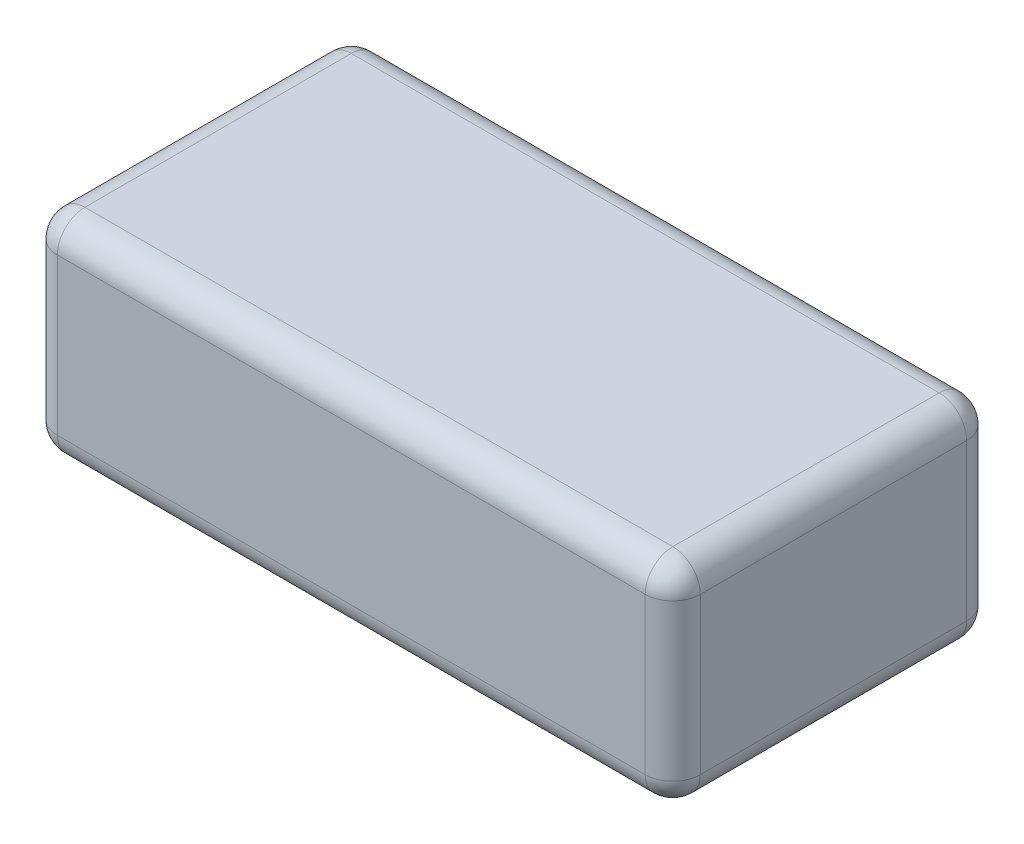
ISO-10303-21;
HEADER;
FILE_DESCRIPTION(('STEP AP214'),'2;1');
FILE_NAME('part.step','',(''),(''),'','','');
FILE_SCHEMA(('AUTOMOTIVE_DESIGN { 1 0 10303 214 1 1 1 1 }'));
ENDSEC;
DATA;
#1=APPLICATION_CONTEXT('core data for automotive mechanical design processes');
#2=APPLICATION_PROTOCOL_DEFINITION('international standard','automotive_design',2000,#1);
#3=PRODUCT_CONTEXT('',#1,'mechanical');
#4=PRODUCT('Part','Part','',(#3));
#5=PRODUCT_RELATED_PRODUCT_CATEGORY('part','',(#4));
#6=PRODUCT_DEFINITION_FORMATION('','',#4);
#7=PRODUCT_DEFINITION_CONTEXT('part definition',#1,'design');
#8=PRODUCT_DEFINITION('design','',#6,#7);
#9=PRODUCT_DEFINITION_SHAPE('','',#8);
#10=(LENGTH_UNIT() NAMED_UNIT(*) SI_UNIT(.MILLI.,.METRE.));
#11=(NAMED_UNIT(*) PLANE_ANGLE_UNIT() SI_UNIT($,.RADIAN.));
#12=(NAMED_UNIT(*) SI_UNIT($,.STERADIAN.) SOLID_ANGLE_UNIT());
#13=UNCERTAINTY_MEASURE_WITH_UNIT(LENGTH_MEASURE(1.E-05),#10,'distance_accuracy_value','');
#14=(GEOMETRIC_REPRESENTATION_CONTEXT(3) GLOBAL_UNCERTAINTY_ASSIGNED_CONTEXT((#13)) GLOBAL_UNIT_ASSIGNED_CONTEXT((#10,
#11,#12)) REPRESENTATION_CONTEXT('',''));
#15=CARTESIAN_POINT('',(0.,0.,0.));
#16=DIRECTION('',(0.,0.,1.));
#17=DIRECTION('',(1.,0.,0.));
#18=AXIS2_PLACEMENT_3D('',#15,#16,#17);
#19=CARTESIAN_POINT('',(-35.,-11.5,17.5));
#20=DIRECTION('',(0.,1.,0.));
#21=DIRECTION('',(0.,0.,1.));
#22=AXIS2_PLACEMENT_3D('',#19,#20,#21);
#23=PLANE('',#22);
#24=DIRECTION('',(0.,0.,-1.));
#25=VECTOR('',#24,1.);
#26=CARTESIAN_POINT('',(32.,-11.5,17.5));
#27=LINE('',#26,#25);
#28=CARTESIAN_POINT('',(32.,-11.5,-14.5));
#29=VERTEX_POINT('',#28);
#30=CARTESIAN_POINT('',(32.,-11.5,14.5));
#31=VERTEX_POINT('',#30);
#32=EDGE_CURVE('E131',#29,#31,#27,.F.);
#33=ORIENTED_EDGE('',*,*,#32,.T.);
#34=DIRECTION('',(1.,0.,0.));
#35=VECTOR('',#34,1.);
#36=CARTESIAN_POINT('',(-35.,-11.5,14.5));
#37=LINE('',#36,#35);
#38=CARTESIAN_POINT('',(-32.,-11.5,14.5));
#39=VERTEX_POINT('',#38);
#40=EDGE_CURVE('E168',#31,#39,#37,.F.);
#41=ORIENTED_EDGE('',*,*,#40,.T.);
#42=DIRECTION('',(0.,0.,-1.));
#43=VECTOR('',#42,1.);
#44=CARTESIAN_POINT('',(-32.,-11.5,17.5));
#45=LINE('',#44,#43);
#46=CARTESIAN_POINT('',(-32.,-11.5,-14.5));
#47=VERTEX_POINT('',#46);
#48=EDGE_CURVE('E165',#39,#47,#45,.T.);
#49=ORIENTED_EDGE('',*,*,#48,.T.);
#50=DIRECTION('',(1.,0.,0.));
#51=VECTOR('',#50,1.);
#52=CARTESIAN_POINT('',(35.,-11.5,-14.5));
#53=LINE('',#52,#51);
#54=EDGE_CURVE('E160',#47,#29,#53,.T.);
#55=ORIENTED_EDGE('',*,*,#54,.T.);
#56=EDGE_LOOP('',(#33,#41,#49,#55));
#57=FACE_BOUND('',#56,.T.);
#58=ADVANCED_FACE('F35',(#57),#23,.F.);
#59=CARTESIAN_POINT('',(35.,11.5,17.5));
#60=DIRECTION('',(1.,0.,0.));
#61=DIRECTION('',(0.,0.,-1.));
#62=AXIS2_PLACEMENT_3D('',#59,#60,#61);
#63=PLANE('',#62);
#64=DIRECTION('',(0.,0.,-1.));
#65=VECTOR('',#64,1.);
#66=CARTESIAN_POINT('',(35.,8.5,17.5));
#67=LINE('',#66,#65);
#68=CARTESIAN_POINT('',(35.,8.5,-14.5));
#69=VERTEX_POINT('',#68);
#70=CARTESIAN_POINT('',(35.,8.5,14.5));
#71=VERTEX_POINT('',#70);
#72=EDGE_CURVE('E153',#69,#71,#67,.F.);
#73=ORIENTED_EDGE('',*,*,#72,.T.);
#74=DIRECTION('',(0.,-1.,0.));
#75=VECTOR('',#74,1.);
#76=CARTESIAN_POINT('',(35.,-11.5,14.5));
#77=LINE('',#76,#75);
#78=CARTESIAN_POINT('',(35.,-8.5,14.5));
#79=VERTEX_POINT('',#78);
#80=EDGE_CURVE('E157',#71,#79,#77,.T.);
#81=ORIENTED_EDGE('',*,*,#80,.T.);
#82=DIRECTION('',(0.,0.,-1.));
#83=VECTOR('',#82,1.);
#84=CARTESIAN_POINT('',(35.,-8.5,-17.5));
#85=LINE('',#84,#83);
#86=CARTESIAN_POINT('',(35.,-8.5,-14.5));
#87=VERTEX_POINT('',#86);
#88=EDGE_CURVE('E129',#79,#87,#85,.T.);
#89=ORIENTED_EDGE('',*,*,#88,.T.);
#90=DIRECTION('',(0.,-1.,0.));
#91=VECTOR('',#90,1.);
#92=CARTESIAN_POINT('',(35.,11.5,-14.5));
#93=LINE('',#92,#91);
#94=EDGE_CURVE('E147',#87,#69,#93,.F.);
#95=ORIENTED_EDGE('',*,*,#94,.T.);
#96=EDGE_LOOP('',(#73,#81,#89,#95));
#97=FACE_BOUND('',#96,.T.);
#98=ADVANCED_FACE('F155',(#97),#63,.T.);
#99=CARTESIAN_POINT('',(-35.,11.5,17.5));
#100=DIRECTION('',(0.,1.,0.));
#101=DIRECTION('',(0.,0.,1.));
#102=AXIS2_PLACEMENT_3D('',#99,#100,#101);
#103=PLANE('',#102);
#104=DIRECTION('',(0.,0.,-1.));
#105=VECTOR('',#104,1.);
#106=CARTESIAN_POINT('',(-32.,11.5,17.5));
#107=LINE('',#106,#105);
#108=CARTESIAN_POINT('',(-32.,11.5,-14.5));
#109=VERTEX_POINT('',#108);
#110=CARTESIAN_POINT('',(-32.,11.5,14.5));
#111=VERTEX_POINT('',#110);
#112=EDGE_CURVE('E172',#109,#111,#107,.F.);
#113=ORIENTED_EDGE('',*,*,#112,.T.);
#114=DIRECTION('',(1.,0.,0.));
#115=VECTOR('',#114,1.);
#116=CARTESIAN_POINT('',(35.,11.5,14.5));
#117=LINE('',#116,#115);
#118=CARTESIAN_POINT('',(32.,11.5,14.5));
#119=VERTEX_POINT('',#118);
#120=EDGE_CURVE('E177',#111,#119,#117,.T.);
#121=ORIENTED_EDGE('',*,*,#120,.T.);
#122=DIRECTION('',(0.,0.,-1.));
#123=VECTOR('',#122,1.);
#124=CARTESIAN_POINT('',(32.,11.5,17.5));
#125=LINE('',#124,#123);
#126=CARTESIAN_POINT('',(32.,11.5,-14.5));
#127=VERTEX_POINT('',#126);
#128=EDGE_CURVE('E174',#119,#127,#125,.T.);
#129=ORIENTED_EDGE('',*,*,#128,.T.);
#130=DIRECTION('',(1.,0.,0.));
#131=VECTOR('',#130,1.);
#132=CARTESIAN_POINT('',(-35.,11.5,-14.5));
#133=LINE('',#132,#131);
#134=EDGE_CURVE('E170',#127,#109,#133,.F.);
#135=ORIENTED_EDGE('',*,*,#134,.T.);
#136=EDGE_LOOP('',(#113,#121,#129,#135));
#137=FACE_BOUND('',#136,.T.);
#138=ADVANCED_FACE('F282',(#137),#103,.T.);
#139=CARTESIAN_POINT('',(-35.,11.5,17.5));
#140=DIRECTION('',(1.,0.,0.));
#141=DIRECTION('',(0.,0.,-1.));
#142=AXIS2_PLACEMENT_3D('',#139,#140,#141);
#143=PLANE('',#142);
#144=DIRECTION('',(0.,0.,-1.));
#145=VECTOR('',#144,1.);
#146=CARTESIAN_POINT('',(-35.,-8.5,17.5));
#147=LINE('',#146,#145);
#148=CARTESIAN_POINT('',(-35.,-8.5,-14.5));
#149=VERTEX_POINT('',#148);
#150=CARTESIAN_POINT('',(-35.,-8.5,14.5));
#151=VERTEX_POINT('',#150);
#152=EDGE_CURVE('E181',#149,#151,#147,.F.);
#153=ORIENTED_EDGE('',*,*,#152,.T.);
#154=DIRECTION('',(0.,-1.,0.));
#155=VECTOR('',#154,1.);
#156=CARTESIAN_POINT('',(-35.,11.5,14.5));
#157=LINE('',#156,#155);
#158=CARTESIAN_POINT('',(-35.,8.5,14.5));
#159=VERTEX_POINT('',#158);
#160=EDGE_CURVE('E186',#151,#159,#157,.F.);
#161=ORIENTED_EDGE('',*,*,#160,.T.);
#162=DIRECTION('',(0.,0.,-1.));
#163=VECTOR('',#162,1.);
#164=CARTESIAN_POINT('',(-35.,8.5,-17.5));
#165=LINE('',#164,#163);
#166=CARTESIAN_POINT('',(-35.,8.5,-14.5));
#167=VERTEX_POINT('',#166);
#168=EDGE_CURVE('E183',#159,#167,#165,.T.);
#169=ORIENTED_EDGE('',*,*,#168,.T.);
#170=DIRECTION('',(0.,-1.,0.));
#171=VECTOR('',#170,1.);
#172=CARTESIAN_POINT('',(-35.,-11.5,-14.5));
#173=LINE('',#172,#171);
#174=EDGE_CURVE('E179',#167,#149,#173,.T.);
#175=ORIENTED_EDGE('',*,*,#174,.T.);
#176=EDGE_LOOP('',(#153,#161,#169,#175));
#177=FACE_BOUND('',#176,.T.);
#178=ADVANCED_FACE('F293',(#177),#143,.F.);
#179=CARTESIAN_POINT('',(0.,0.,17.5));
#180=DIRECTION('',(0.,0.,-1.));
#181=DIRECTION('',(-1.,0.,0.));
#182=AXIS2_PLACEMENT_3D('',#179,#180,#181);
#183=PLANE('',#182);
#184=DIRECTION('',(1.,0.,0.));
#185=VECTOR('',#184,1.);
#186=CARTESIAN_POINT('',(-35.,8.5,17.5));
#187=LINE('',#186,#185);
#188=CARTESIAN_POINT('',(32.,8.5,17.5));
#189=VERTEX_POINT('',#188);
#190=CARTESIAN_POINT('',(-32.,8.5,17.5));
#191=VERTEX_POINT('',#190);
#192=EDGE_CURVE('E192',#189,#191,#187,.F.);
#193=ORIENTED_EDGE('',*,*,#192,.T.);
#194=DIRECTION('',(0.,-1.,0.));
#195=VECTOR('',#194,1.);
#196=CARTESIAN_POINT('',(-32.,0.,17.5));
#197=LINE('',#196,#195);
#198=CARTESIAN_POINT('',(-32.,-8.5,17.5));
#199=VERTEX_POINT('',#198);
#200=EDGE_CURVE('E194',#191,#199,#197,.T.);
#201=ORIENTED_EDGE('',*,*,#200,.T.);
#202=DIRECTION('',(1.,0.,0.));
#203=VECTOR('',#202,1.);
#204=CARTESIAN_POINT('',(0.,-8.5,17.5));
#205=LINE('',#204,#203);
#206=CARTESIAN_POINT('',(32.,-8.5,17.5));
#207=VERTEX_POINT('',#206);
#208=EDGE_CURVE('E188',#199,#207,#205,.T.);
#209=ORIENTED_EDGE('',*,*,#208,.T.);
#210=DIRECTION('',(0.,-1.,0.));
#211=VECTOR('',#210,1.);
#212=CARTESIAN_POINT('',(32.,11.5,17.5));
#213=LINE('',#212,#211);
#214=EDGE_CURVE('E190',#207,#189,#213,.F.);
#215=ORIENTED_EDGE('',*,*,#214,.T.);
#216=EDGE_LOOP('',(#193,#201,#209,#215));
#217=FACE_BOUND('',#216,.T.);
#218=ADVANCED_FACE('F274',(#217),#183,.F.);
#219=CARTESIAN_POINT('',(0.,0.,-17.5));
#220=DIRECTION('',(0.,0.,-1.));
#221=DIRECTION('',(-1.,0.,0.));
#222=AXIS2_PLACEMENT_3D('',#219,#220,#221);
#223=PLANE('',#222);
#224=DIRECTION('',(1.,0.,0.));
#225=VECTOR('',#224,1.);
#226=CARTESIAN_POINT('',(0.,8.5,-17.5));
#227=LINE('',#226,#225);
#228=CARTESIAN_POINT('',(-32.,8.5,-17.5));
#229=VERTEX_POINT('',#228);
#230=CARTESIAN_POINT('',(32.,8.5,-17.5));
#231=VERTEX_POINT('',#230);
#232=EDGE_CURVE('E44',#229,#231,#227,.T.);
#233=ORIENTED_EDGE('',*,*,#232,.T.);
#234=DIRECTION('',(0.,-1.,0.));
#235=VECTOR('',#234,1.);
#236=CARTESIAN_POINT('',(32.,0.,-17.5));
#237=LINE('',#236,#235);
#238=CARTESIAN_POINT('',(32.,-8.5,-17.5));
#239=VERTEX_POINT('',#238);
#240=EDGE_CURVE('E11',#231,#239,#237,.T.);
#241=ORIENTED_EDGE('',*,*,#240,.T.);
#242=DIRECTION('',(1.,0.,0.));
#243=VECTOR('',#242,1.);
#244=CARTESIAN_POINT('',(-35.,-8.5,-17.5));
#245=LINE('',#244,#243);
#246=CARTESIAN_POINT('',(-32.,-8.5,-17.5));
#247=VERTEX_POINT('',#246);
#248=EDGE_CURVE('E197',#239,#247,#245,.F.);
#249=ORIENTED_EDGE('',*,*,#248,.T.);
#250=DIRECTION('',(0.,-1.,0.));
#251=VECTOR('',#250,1.);
#252=CARTESIAN_POINT('',(-32.,11.5,-17.5));
#253=LINE('',#252,#251);
#254=EDGE_CURVE('E55',#247,#229,#253,.F.);
#255=ORIENTED_EDGE('',*,*,#254,.T.);
#256=EDGE_LOOP('',(#233,#241,#249,#255));
#257=FACE_BOUND('',#256,.T.);
#258=ADVANCED_FACE('F480',(#257),#223,.T.);
#259=CARTESIAN_POINT('',(-32.,8.5,17.5));
#260=DIRECTION('',(0.,0.,1.));
#261=DIRECTION('',(1.,0.,0.));
#262=AXIS2_PLACEMENT_3D('',#259,#260,#261);
#263=CYLINDRICAL_SURFACE('',#262,3.);
#264=CARTESIAN_POINT('',(-32.,8.5,14.5));
#265=DIRECTION('',(0.,0.,1.));
#266=DIRECTION('',(1.,0.,0.));
#267=AXIS2_PLACEMENT_3D('',#264,#265,#266);
#268=CIRCLE('',#267,3.);
#269=EDGE_CURVE('E39',#111,#159,#268,.T.);
#270=ORIENTED_EDGE('',*,*,#269,.F.);
#271=ORIENTED_EDGE('',*,*,#112,.F.);
#272=CARTESIAN_POINT('',(-32.,8.5,-14.5));
#273=DIRECTION('',(0.,0.,-1.));
#274=DIRECTION('',(0.,1.,0.));
#275=AXIS2_PLACEMENT_3D('',#272,#273,#274);
#276=CIRCLE('',#275,3.);
#277=EDGE_CURVE('E251',#167,#109,#276,.T.);
#278=ORIENTED_EDGE('',*,*,#277,.F.);
#279=ORIENTED_EDGE('',*,*,#168,.F.);
#280=EDGE_LOOP('',(#270,#271,#278,#279));
#281=FACE_BOUND('',#280,.T.);
#282=ADVANCED_FACE('F37',(#281),#263,.T.);
#283=CARTESIAN_POINT('',(-32.,8.5,14.5));
#284=DIRECTION('',(0.,0.,1.));
#285=DIRECTION('',(1.,0.,0.));
#286=AXIS2_PLACEMENT_3D('',#283,#284,#285);
#287=SPHERICAL_SURFACE('',#286,3.);
#288=CARTESIAN_POINT('',(-32.,8.5,14.5));
#289=DIRECTION('',(-1.,0.,0.));
#290=DIRECTION('',(0.,0.,1.));
#291=AXIS2_PLACEMENT_3D('',#288,#289,#290);
#292=CIRCLE('',#291,3.);
#293=EDGE_CURVE('E246',#111,#191,#292,.F.);
#294=ORIENTED_EDGE('',*,*,#293,.F.);
#295=ORIENTED_EDGE('',*,*,#269,.T.);
#296=CARTESIAN_POINT('',(-32.,8.5,14.5));
#297=DIRECTION('',(0.,1.,0.));
#298=DIRECTION('',(0.,0.,1.));
#299=AXIS2_PLACEMENT_3D('',#296,#297,#298);
#300=CIRCLE('',#299,3.);
#301=EDGE_CURVE('E249',#191,#159,#300,.F.);
#302=ORIENTED_EDGE('',*,*,#301,.F.);
#303=EDGE_LOOP('',(#294,#295,#302));
#304=FACE_BOUND('',#303,.T.);
#305=ADVANCED_FACE('F262',(#304),#287,.T.);
#306=CARTESIAN_POINT('',(-32.,8.5,-14.5));
#307=DIRECTION('',(0.,0.,1.));
#308=DIRECTION('',(1.,0.,0.));
#309=AXIS2_PLACEMENT_3D('',#306,#307,#308);
#310=SPHERICAL_SURFACE('',#309,3.);
#311=CARTESIAN_POINT('',(-32.,8.5,-14.5));
#312=DIRECTION('',(0.,1.,0.));
#313=DIRECTION('',(0.,0.,1.));
#314=AXIS2_PLACEMENT_3D('',#311,#312,#313);
#315=CIRCLE('',#314,3.);
#316=EDGE_CURVE('E241',#167,#229,#315,.F.);
#317=ORIENTED_EDGE('',*,*,#316,.F.);
#318=ORIENTED_EDGE('',*,*,#277,.T.);
#319=CARTESIAN_POINT('',(-32.,8.5,-14.5));
#320=DIRECTION('',(-1.,0.,0.));
#321=DIRECTION('',(0.,0.,1.));
#322=AXIS2_PLACEMENT_3D('',#319,#320,#321);
#323=CIRCLE('',#322,3.);
#324=EDGE_CURVE('E243',#229,#109,#323,.F.);
#325=ORIENTED_EDGE('',*,*,#324,.F.);
#326=EDGE_LOOP('',(#317,#318,#325));
#327=FACE_BOUND('',#326,.T.);
#328=ADVANCED_FACE('F459',(#327),#310,.T.);
#329=CARTESIAN_POINT('',(-32.,0.,14.5));
#330=DIRECTION('',(0.,-1.,0.));
#331=DIRECTION('',(0.,0.,-1.));
#332=AXIS2_PLACEMENT_3D('',#329,#330,#331);
#333=CYLINDRICAL_SURFACE('',#332,3.);
#334=ORIENTED_EDGE('',*,*,#301,.T.);
#335=ORIENTED_EDGE('',*,*,#160,.F.);
#336=CARTESIAN_POINT('',(-32.,-8.5,14.5));
#337=DIRECTION('',(0.,-1.,0.));
#338=DIRECTION('',(0.,0.,-1.));
#339=AXIS2_PLACEMENT_3D('',#336,#337,#338);
#340=CIRCLE('',#339,3.);
#341=EDGE_CURVE('E235',#199,#151,#340,.T.);
#342=ORIENTED_EDGE('',*,*,#341,.F.);
#343=ORIENTED_EDGE('',*,*,#200,.F.);
#344=EDGE_LOOP('',(#334,#335,#342,#343));
#345=FACE_BOUND('',#344,.T.);
#346=ADVANCED_FACE('F270',(#345),#333,.T.);
#347=CARTESIAN_POINT('',(-35.,8.5,14.5));
#348=DIRECTION('',(-1.,0.,0.));
#349=DIRECTION('',(0.,0.,1.));
#350=AXIS2_PLACEMENT_3D('',#347,#348,#349);
#351=CYLINDRICAL_SURFACE('',#350,3.);
#352=ORIENTED_EDGE('',*,*,#293,.T.);
#353=ORIENTED_EDGE('',*,*,#192,.F.);
#354=CARTESIAN_POINT('',(32.,8.5,14.5));
#355=DIRECTION('',(1.,0.,0.));
#356=DIRECTION('',(0.,0.,-1.));
#357=AXIS2_PLACEMENT_3D('',#354,#355,#356);
#358=CIRCLE('',#357,3.);
#359=EDGE_CURVE('E232',#119,#189,#358,.T.);
#360=ORIENTED_EDGE('',*,*,#359,.F.);
#361=ORIENTED_EDGE('',*,*,#120,.F.);
#362=EDGE_LOOP('',(#352,#353,#360,#361));
#363=FACE_BOUND('',#362,.T.);
#364=ADVANCED_FACE('F279',(#363),#351,.T.);
#365=CARTESIAN_POINT('',(32.,8.5,17.5));
#366=DIRECTION('',(0.,0.,-1.));
#367=DIRECTION('',(-1.,0.,0.));
#368=AXIS2_PLACEMENT_3D('',#365,#366,#367);
#369=CYLINDRICAL_SURFACE('',#368,3.);
#370=CARTESIAN_POINT('',(32.,8.5,-14.5));
#371=DIRECTION('',(0.,0.,-1.));
#372=DIRECTION('',(-1.,0.,0.));
#373=AXIS2_PLACEMENT_3D('',#370,#371,#372);
#374=CIRCLE('',#373,3.);
#375=EDGE_CURVE('E226',#127,#69,#374,.T.);
#376=ORIENTED_EDGE('',*,*,#375,.F.);
#377=ORIENTED_EDGE('',*,*,#128,.F.);
#378=CARTESIAN_POINT('',(32.,8.5,14.5));
#379=DIRECTION('',(0.,0.,1.));
#380=DIRECTION('',(1.,0.,0.));
#381=AXIS2_PLACEMENT_3D('',#378,#379,#380);
#382=CIRCLE('',#381,3.);
#383=EDGE_CURVE('E229',#71,#119,#382,.T.);
#384=ORIENTED_EDGE('',*,*,#383,.F.);
#385=ORIENTED_EDGE('',*,*,#72,.F.);
#386=EDGE_LOOP('',(#376,#377,#384,#385));
#387=FACE_BOUND('',#386,.T.);
#388=ADVANCED_FACE('F286',(#387),#369,.T.);
#389=CARTESIAN_POINT('',(0.,8.5,-14.5));
#390=DIRECTION('',(1.,0.,0.));
#391=DIRECTION('',(0.,0.,-1.));
#392=AXIS2_PLACEMENT_3D('',#389,#390,#391);
#393=CYLINDRICAL_SURFACE('',#392,3.);
#394=ORIENTED_EDGE('',*,*,#324,.T.);
#395=ORIENTED_EDGE('',*,*,#134,.F.);
#396=CARTESIAN_POINT('',(32.,8.5,-14.5));
#397=DIRECTION('',(1.,0.,0.));
#398=DIRECTION('',(0.,0.,-1.));
#399=AXIS2_PLACEMENT_3D('',#396,#397,#398);
#400=CIRCLE('',#399,3.);
#401=EDGE_CURVE('E224',#231,#127,#400,.T.);
#402=ORIENTED_EDGE('',*,*,#401,.F.);
#403=ORIENTED_EDGE('',*,*,#232,.F.);
#404=EDGE_LOOP('',(#394,#395,#402,#403));
#405=FACE_BOUND('',#404,.T.);
#406=ADVANCED_FACE('F291',(#405),#393,.T.);
#407=CARTESIAN_POINT('',(-32.,11.5,-14.5));
#408=DIRECTION('',(0.,1.,0.));
#409=DIRECTION('',(0.,0.,1.));
#410=AXIS2_PLACEMENT_3D('',#407,#408,#409);
#411=CYLINDRICAL_SURFACE('',#410,3.);
#412=ORIENTED_EDGE('',*,*,#316,.T.);
#413=ORIENTED_EDGE('',*,*,#254,.F.);
#414=CARTESIAN_POINT('',(-32.,-8.5,-14.5));
#415=DIRECTION('',(0.,-1.,0.));
#416=DIRECTION('',(0.,0.,-1.));
#417=AXIS2_PLACEMENT_3D('',#414,#415,#416);
#418=CIRCLE('',#417,3.);
#419=EDGE_CURVE('E221',#149,#247,#418,.T.);
#420=ORIENTED_EDGE('',*,*,#419,.F.);
#421=ORIENTED_EDGE('',*,*,#174,.F.);
#422=EDGE_LOOP('',(#412,#413,#420,#421));
#423=FACE_BOUND('',#422,.T.);
#424=ADVANCED_FACE('F302',(#423),#411,.T.);
#425=CARTESIAN_POINT('',(-32.,-8.5,17.5));
#426=DIRECTION('',(0.,0.,-1.));
#427=DIRECTION('',(-1.,0.,0.));
#428=AXIS2_PLACEMENT_3D('',#425,#426,#427);
#429=CYLINDRICAL_SURFACE('',#428,3.);
#430=CARTESIAN_POINT('',(-32.,-8.5,14.5));
#431=DIRECTION('',(0.,0.,1.));
#432=DIRECTION('',(1.,0.,0.));
#433=AXIS2_PLACEMENT_3D('',#430,#431,#432);
#434=CIRCLE('',#433,3.);
#435=EDGE_CURVE('E238',#151,#39,#434,.T.);
#436=ORIENTED_EDGE('',*,*,#435,.F.);
#437=ORIENTED_EDGE('',*,*,#152,.F.);
#438=CARTESIAN_POINT('',(-32.,-8.5,-14.5));
#439=DIRECTION('',(0.,0.,-1.));
#440=DIRECTION('',(-1.,0.,0.));
#441=AXIS2_PLACEMENT_3D('',#438,#439,#440);
#442=CIRCLE('',#441,3.);
#443=EDGE_CURVE('E218',#47,#149,#442,.T.);
#444=ORIENTED_EDGE('',*,*,#443,.F.);
#445=ORIENTED_EDGE('',*,*,#48,.F.);
#446=EDGE_LOOP('',(#436,#437,#444,#445));
#447=FACE_BOUND('',#446,.T.);
#448=ADVANCED_FACE('F298',(#447),#429,.T.);
#449=CARTESIAN_POINT('',(-32.,-8.5,14.5));
#450=DIRECTION('',(0.,0.,1.));
#451=DIRECTION('',(1.,0.,0.));
#452=AXIS2_PLACEMENT_3D('',#449,#450,#451);
#453=SPHERICAL_SURFACE('',#452,3.);
#454=ORIENTED_EDGE('',*,*,#341,.T.);
#455=ORIENTED_EDGE('',*,*,#435,.T.);
#456=CARTESIAN_POINT('',(-32.,-8.5,14.5));
#457=DIRECTION('',(-1.,0.,0.));
#458=DIRECTION('',(0.,0.,1.));
#459=AXIS2_PLACEMENT_3D('',#456,#457,#458);
#460=CIRCLE('',#459,3.);
#461=EDGE_CURVE('E215',#199,#39,#460,.F.);
#462=ORIENTED_EDGE('',*,*,#461,.F.);
#463=EDGE_LOOP('',(#454,#455,#462));
#464=FACE_BOUND('',#463,.T.);
#465=ADVANCED_FACE('F312',(#464),#453,.T.);
#466=CARTESIAN_POINT('',(32.,8.5,14.5));
#467=DIRECTION('',(0.,0.,1.));
#468=DIRECTION('',(1.,0.,0.));
#469=AXIS2_PLACEMENT_3D('',#466,#467,#468);
#470=SPHERICAL_SURFACE('',#469,3.);
#471=ORIENTED_EDGE('',*,*,#383,.T.);
#472=ORIENTED_EDGE('',*,*,#359,.T.);
#473=CARTESIAN_POINT('',(32.,8.5,14.5));
#474=DIRECTION('',(0.,1.,0.));
#475=DIRECTION('',(0.,0.,1.));
#476=AXIS2_PLACEMENT_3D('',#473,#474,#475);
#477=CIRCLE('',#476,3.);
#478=EDGE_CURVE('E212',#71,#189,#477,.F.);
#479=ORIENTED_EDGE('',*,*,#478,.F.);
#480=EDGE_LOOP('',(#471,#472,#479));
#481=FACE_BOUND('',#480,.T.);
#482=ADVANCED_FACE('F322',(#481),#470,.T.);
#483=CARTESIAN_POINT('',(32.,8.5,-14.5));
#484=DIRECTION('',(0.,0.,1.));
#485=DIRECTION('',(1.,0.,0.));
#486=AXIS2_PLACEMENT_3D('',#483,#484,#485);
#487=SPHERICAL_SURFACE('',#486,3.);
#488=ORIENTED_EDGE('',*,*,#401,.T.);
#489=ORIENTED_EDGE('',*,*,#375,.T.);
#490=CARTESIAN_POINT('',(32.,8.5,-14.5));
#491=DIRECTION('',(0.,1.,0.));
#492=DIRECTION('',(0.,0.,1.));
#493=AXIS2_PLACEMENT_3D('',#490,#491,#492);
#494=CIRCLE('',#493,3.);
#495=EDGE_CURVE('E150',#231,#69,#494,.F.);
#496=ORIENTED_EDGE('',*,*,#495,.F.);
#497=EDGE_LOOP('',(#488,#489,#496));
#498=FACE_BOUND('',#497,.T.);
#499=ADVANCED_FACE('F324',(#498),#487,.T.);
#500=CARTESIAN_POINT('',(-32.,-8.5,-14.5));
#501=DIRECTION('',(0.,0.,1.));
#502=DIRECTION('',(1.,0.,0.));
#503=AXIS2_PLACEMENT_3D('',#500,#501,#502);
#504=SPHERICAL_SURFACE('',#503,3.);
#505=ORIENTED_EDGE('',*,*,#443,.T.);
#506=ORIENTED_EDGE('',*,*,#419,.T.);
#507=CARTESIAN_POINT('',(-32.,-8.5,-14.5));
#508=DIRECTION('',(-1.,0.,0.));
#509=DIRECTION('',(0.,0.,1.));
#510=AXIS2_PLACEMENT_3D('',#507,#508,#509);
#511=CIRCLE('',#510,3.);
#512=EDGE_CURVE('E208',#47,#247,#511,.F.);
#513=ORIENTED_EDGE('',*,*,#512,.F.);
#514=EDGE_LOOP('',(#505,#506,#513));
#515=FACE_BOUND('',#514,.T.);
#516=ADVANCED_FACE('F304',(#515),#504,.T.);
#517=CARTESIAN_POINT('',(0.,-8.5,14.5));
#518=DIRECTION('',(1.,0.,0.));
#519=DIRECTION('',(0.,0.,-1.));
#520=AXIS2_PLACEMENT_3D('',#517,#518,#519);
#521=CYLINDRICAL_SURFACE('',#520,3.);
#522=ORIENTED_EDGE('',*,*,#461,.T.);
#523=ORIENTED_EDGE('',*,*,#40,.F.);
#524=CARTESIAN_POINT('',(32.,-8.5,14.5));
#525=DIRECTION('',(1.,0.,0.));
#526=DIRECTION('',(0.,0.,-1.));
#527=AXIS2_PLACEMENT_3D('',#524,#525,#526);
#528=CIRCLE('',#527,3.);
#529=EDGE_CURVE('E205',#207,#31,#528,.T.);
#530=ORIENTED_EDGE('',*,*,#529,.F.);
#531=ORIENTED_EDGE('',*,*,#208,.F.);
#532=EDGE_LOOP('',(#522,#523,#530,#531));
#533=FACE_BOUND('',#532,.T.);
#534=ADVANCED_FACE('F314',(#533),#521,.T.);
#535=CARTESIAN_POINT('',(32.,11.5,14.5));
#536=DIRECTION('',(0.,1.,0.));
#537=DIRECTION('',(0.,0.,1.));
#538=AXIS2_PLACEMENT_3D('',#535,#536,#537);
#539=CYLINDRICAL_SURFACE('',#538,3.);
#540=ORIENTED_EDGE('',*,*,#478,.T.);
#541=ORIENTED_EDGE('',*,*,#214,.F.);
#542=CARTESIAN_POINT('',(32.,-8.5,14.5));
#543=DIRECTION('',(0.,-1.,0.));
#544=DIRECTION('',(0.,0.,-1.));
#545=AXIS2_PLACEMENT_3D('',#542,#543,#544);
#546=CIRCLE('',#545,3.);
#547=EDGE_CURVE('E144',#79,#207,#546,.T.);
#548=ORIENTED_EDGE('',*,*,#547,.F.);
#549=ORIENTED_EDGE('',*,*,#80,.F.);
#550=EDGE_LOOP('',(#540,#541,#548,#549));
#551=FACE_BOUND('',#550,.T.);
#552=ADVANCED_FACE('F320',(#551),#539,.T.);
#553=CARTESIAN_POINT('',(32.,0.,-14.5));
#554=DIRECTION('',(0.,-1.,0.));
#555=DIRECTION('',(0.,0.,-1.));
#556=AXIS2_PLACEMENT_3D('',#553,#554,#555);
#557=CYLINDRICAL_SURFACE('',#556,3.);
#558=ORIENTED_EDGE('',*,*,#495,.T.);
#559=ORIENTED_EDGE('',*,*,#94,.F.);
#560=CARTESIAN_POINT('',(32.,-8.5,-14.5));
#561=DIRECTION('',(0.,-1.,0.));
#562=DIRECTION('',(0.,0.,-1.));
#563=AXIS2_PLACEMENT_3D('',#560,#561,#562);
#564=CIRCLE('',#563,3.);
#565=EDGE_CURVE('E136',#239,#87,#564,.T.);
#566=ORIENTED_EDGE('',*,*,#565,.F.);
#567=ORIENTED_EDGE('',*,*,#240,.F.);
#568=EDGE_LOOP('',(#558,#559,#566,#567));
#569=FACE_BOUND('',#568,.T.);
#570=ADVANCED_FACE('F148',(#569),#557,.T.);
#571=CARTESIAN_POINT('',(-35.,-8.5,-14.5));
#572=DIRECTION('',(-1.,0.,0.));
#573=DIRECTION('',(0.,0.,1.));
#574=AXIS2_PLACEMENT_3D('',#571,#572,#573);
#575=CYLINDRICAL_SURFACE('',#574,3.);
#576=ORIENTED_EDGE('',*,*,#512,.T.);
#577=ORIENTED_EDGE('',*,*,#248,.F.);
#578=CARTESIAN_POINT('',(32.,-8.5,-14.5));
#579=DIRECTION('',(1.,0.,0.));
#580=DIRECTION('',(0.,0.,-1.));
#581=AXIS2_PLACEMENT_3D('',#578,#579,#580);
#582=CIRCLE('',#581,3.);
#583=EDGE_CURVE('E140',#29,#239,#582,.T.);
#584=ORIENTED_EDGE('',*,*,#583,.F.);
#585=ORIENTED_EDGE('',*,*,#54,.F.);
#586=EDGE_LOOP('',(#576,#577,#584,#585));
#587=FACE_BOUND('',#586,.T.);
#588=ADVANCED_FACE('F307',(#587),#575,.T.);
#589=CARTESIAN_POINT('',(32.,-8.5,14.5));
#590=DIRECTION('',(0.,0.,1.));
#591=DIRECTION('',(1.,0.,0.));
#592=AXIS2_PLACEMENT_3D('',#589,#590,#591);
#593=SPHERICAL_SURFACE('',#592,3.);
#594=ORIENTED_EDGE('',*,*,#547,.T.);
#595=ORIENTED_EDGE('',*,*,#529,.T.);
#596=CARTESIAN_POINT('',(32.,-8.5,14.5));
#597=DIRECTION('',(0.,0.,1.));
#598=DIRECTION('',(1.,0.,0.));
#599=AXIS2_PLACEMENT_3D('',#596,#597,#598);
#600=CIRCLE('',#599,3.);
#601=EDGE_CURVE('E133',#79,#31,#600,.F.);
#602=ORIENTED_EDGE('',*,*,#601,.F.);
#603=EDGE_LOOP('',(#594,#595,#602));
#604=FACE_BOUND('',#603,.T.);
#605=ADVANCED_FACE('F318',(#604),#593,.T.);
#606=CARTESIAN_POINT('',(32.,-8.5,-14.5));
#607=DIRECTION('',(0.,0.,1.));
#608=DIRECTION('',(1.,0.,0.));
#609=AXIS2_PLACEMENT_3D('',#606,#607,#608);
#610=SPHERICAL_SURFACE('',#609,3.);
#611=ORIENTED_EDGE('',*,*,#583,.T.);
#612=ORIENTED_EDGE('',*,*,#565,.T.);
#613=CARTESIAN_POINT('',(32.,-8.5,-14.5));
#614=DIRECTION('',(0.,0.,-1.));
#615=DIRECTION('',(0.,1.,0.));
#616=AXIS2_PLACEMENT_3D('',#613,#614,#615);
#617=CIRCLE('',#616,3.);
#618=EDGE_CURVE('E125',#29,#87,#617,.F.);
#619=ORIENTED_EDGE('',*,*,#618,.F.);
#620=EDGE_LOOP('',(#611,#612,#619));
#621=FACE_BOUND('',#620,.T.);
#622=ADVANCED_FACE('F138',(#621),#610,.T.);
#623=CARTESIAN_POINT('',(32.,-8.5,17.5));
#624=DIRECTION('',(0.,0.,1.));
#625=DIRECTION('',(1.,0.,0.));
#626=AXIS2_PLACEMENT_3D('',#623,#624,#625);
#627=CYLINDRICAL_SURFACE('',#626,3.);
#628=ORIENTED_EDGE('',*,*,#601,.T.);
#629=ORIENTED_EDGE('',*,*,#32,.F.);
#630=ORIENTED_EDGE('',*,*,#618,.T.);
#631=ORIENTED_EDGE('',*,*,#88,.F.);
#632=EDGE_LOOP('',(#628,#629,#630,#631));
#633=FACE_BOUND('',#632,.T.);
#634=ADVANCED_FACE('F127',(#633),#627,.T.);
#635=CLOSED_SHELL('',(#58,#98,#138,#178,#218,#258,#282,#305,#328,#346,#364,#388,#406,#424,#448,
#465,#482,#499,#516,#534,#552,#570,#588,#605,#622,#634));
#636=MANIFOLD_SOLID_BREP('B2',#635);
#637=ADVANCED_BREP_SHAPE_REPRESENTATION('',(#18,#636),#14);
#638=SHAPE_DEFINITION_REPRESENTATION(#9,#637);
ENDSEC;
END-ISO-10303-21;
